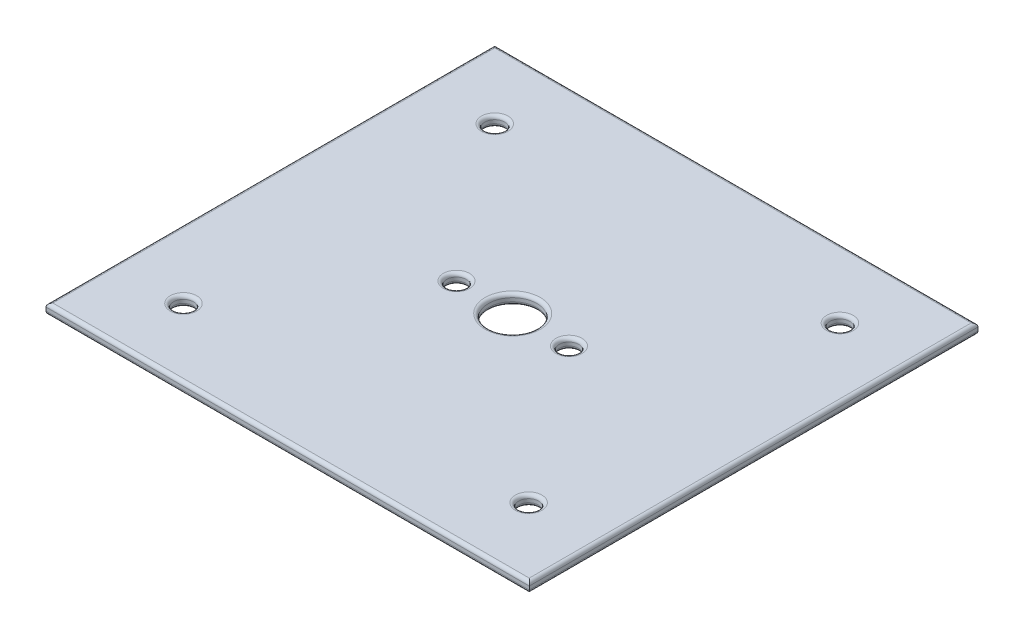
ISO-10303-21;
HEADER;
FILE_DESCRIPTION(('STEP AP214'),'2;1');
FILE_NAME('part.step','',(''),(''),'','','');
FILE_SCHEMA(('AUTOMOTIVE_DESIGN { 1 0 10303 214 1 1 1 1 }'));
ENDSEC;
DATA;
#1=APPLICATION_CONTEXT('core data for automotive mechanical design processes');
#2=APPLICATION_PROTOCOL_DEFINITION('international standard','automotive_design',2000,#1);
#3=PRODUCT_CONTEXT('',#1,'mechanical');
#4=PRODUCT('Part','Part','',(#3));
#5=PRODUCT_RELATED_PRODUCT_CATEGORY('part','',(#4));
#6=PRODUCT_DEFINITION_FORMATION('','',#4);
#7=PRODUCT_DEFINITION_CONTEXT('part definition',#1,'design');
#8=PRODUCT_DEFINITION('design','',#6,#7);
#9=PRODUCT_DEFINITION_SHAPE('','',#8);
#10=(LENGTH_UNIT() NAMED_UNIT(*) SI_UNIT(.MILLI.,.METRE.));
#11=(NAMED_UNIT(*) PLANE_ANGLE_UNIT() SI_UNIT($,.RADIAN.));
#12=(NAMED_UNIT(*) SI_UNIT($,.STERADIAN.) SOLID_ANGLE_UNIT());
#13=UNCERTAINTY_MEASURE_WITH_UNIT(LENGTH_MEASURE(1.E-05),#10,'distance_accuracy_value','');
#14=(GEOMETRIC_REPRESENTATION_CONTEXT(3) GLOBAL_UNCERTAINTY_ASSIGNED_CONTEXT((#13)) GLOBAL_UNIT_ASSIGNED_CONTEXT((#10,
#11,#12)) REPRESENTATION_CONTEXT('',''));
#15=CARTESIAN_POINT('',(0.,0.,0.));
#16=DIRECTION('',(0.,0.,1.));
#17=DIRECTION('',(1.,0.,0.));
#18=AXIS2_PLACEMENT_3D('',#15,#16,#17);
#19=CARTESIAN_POINT('',(0.,1.5,0.));
#20=DIRECTION('',(1.,0.,0.));
#21=DIRECTION('',(0.,0.,-1.));
#22=AXIS2_PLACEMENT_3D('',#19,#20,#21);
#23=PLANE('',#22);
#24=DIRECTION('',(0.,-1.,0.));
#25=VECTOR('',#24,1.);
#26=CARTESIAN_POINT('',(0.,1.5,-65.));
#27=LINE('',#26,#25);
#28=CARTESIAN_POINT('',(0.,1.,-65.));
#29=VERTEX_POINT('',#28);
#30=CARTESIAN_POINT('',(0.,0.5,-65.));
#31=VERTEX_POINT('',#30);
#32=EDGE_CURVE('E162',#29,#31,#27,.T.);
#33=ORIENTED_EDGE('',*,*,#32,.T.);
#34=DIRECTION('',(0.,0.,1.));
#35=VECTOR('',#34,1.);
#36=CARTESIAN_POINT('',(0.,0.5,0.));
#37=LINE('',#36,#35);
#38=CARTESIAN_POINT('',(0.,0.5,0.));
#39=VERTEX_POINT('',#38);
#40=EDGE_CURVE('E260',#31,#39,#37,.T.);
#41=ORIENTED_EDGE('',*,*,#40,.T.);
#42=DIRECTION('',(0.,-1.,0.));
#43=VECTOR('',#42,1.);
#44=CARTESIAN_POINT('',(0.,1.5,0.));
#45=LINE('',#44,#43);
#46=CARTESIAN_POINT('',(0.,1.,0.));
#47=VERTEX_POINT('',#46);
#48=EDGE_CURVE('E132',#47,#39,#45,.T.);
#49=ORIENTED_EDGE('',*,*,#48,.F.);
#50=DIRECTION('',(0.,0.,1.));
#51=VECTOR('',#50,1.);
#52=CARTESIAN_POINT('',(0.,1.,0.));
#53=LINE('',#52,#51);
#54=EDGE_CURVE('E263',#47,#29,#53,.F.);
#55=ORIENTED_EDGE('',*,*,#54,.T.);
#56=EDGE_LOOP('',(#33,#41,#49,#55));
#57=FACE_BOUND('',#56,.T.);
#58=ADVANCED_FACE('F42',(#57),#23,.F.);
#59=CARTESIAN_POINT('',(0.,1.5,0.));
#60=DIRECTION('',(0.,0.,-1.));
#61=DIRECTION('',(-1.,0.,0.));
#62=AXIS2_PLACEMENT_3D('',#59,#60,#61);
#63=PLANE('',#62);
#64=ORIENTED_EDGE('',*,*,#48,.T.);
#65=DIRECTION('',(1.,0.,0.));
#66=VECTOR('',#65,1.);
#67=CARTESIAN_POINT('',(70.,0.5,0.));
#68=LINE('',#67,#66);
#69=CARTESIAN_POINT('',(70.,0.5,0.));
#70=VERTEX_POINT('',#69);
#71=EDGE_CURVE('E130',#39,#70,#68,.T.);
#72=ORIENTED_EDGE('',*,*,#71,.T.);
#73=DIRECTION('',(0.,-1.,0.));
#74=VECTOR('',#73,1.);
#75=CARTESIAN_POINT('',(70.,1.5,0.));
#76=LINE('',#75,#74);
#77=CARTESIAN_POINT('',(70.,1.,0.));
#78=VERTEX_POINT('',#77);
#79=EDGE_CURVE('E112',#78,#70,#76,.T.);
#80=ORIENTED_EDGE('',*,*,#79,.F.);
#81=DIRECTION('',(1.,0.,0.));
#82=VECTOR('',#81,1.);
#83=CARTESIAN_POINT('',(0.,1.,0.));
#84=LINE('',#83,#82);
#85=EDGE_CURVE('E127',#78,#47,#84,.F.);
#86=ORIENTED_EDGE('',*,*,#85,.T.);
#87=EDGE_LOOP('',(#64,#72,#80,#86));
#88=FACE_BOUND('',#87,.T.);
#89=ADVANCED_FACE('F126',(#88),#63,.F.);
#90=CARTESIAN_POINT('',(70.,1.5,0.));
#91=DIRECTION('',(-1.,0.,0.));
#92=DIRECTION('',(0.,0.,1.));
#93=AXIS2_PLACEMENT_3D('',#90,#91,#92);
#94=PLANE('',#93);
#95=ORIENTED_EDGE('',*,*,#79,.T.);
#96=DIRECTION('',(0.,0.,-1.));
#97=VECTOR('',#96,1.);
#98=CARTESIAN_POINT('',(70.,0.5,-65.));
#99=LINE('',#98,#97);
#100=CARTESIAN_POINT('',(70.,0.5,-65.));
#101=VERTEX_POINT('',#100);
#102=EDGE_CURVE('E119',#70,#101,#99,.T.);
#103=ORIENTED_EDGE('',*,*,#102,.T.);
#104=DIRECTION('',(0.,-1.,0.));
#105=VECTOR('',#104,1.);
#106=CARTESIAN_POINT('',(70.,1.5,-65.));
#107=LINE('',#106,#105);
#108=CARTESIAN_POINT('',(70.,1.,-65.));
#109=VERTEX_POINT('',#108);
#110=EDGE_CURVE('E114',#109,#101,#107,.T.);
#111=ORIENTED_EDGE('',*,*,#110,.F.);
#112=DIRECTION('',(0.,0.,-1.));
#113=VECTOR('',#112,1.);
#114=CARTESIAN_POINT('',(70.,1.,0.));
#115=LINE('',#114,#113);
#116=EDGE_CURVE('E109',#109,#78,#115,.F.);
#117=ORIENTED_EDGE('',*,*,#116,.T.);
#118=EDGE_LOOP('',(#95,#103,#111,#117));
#119=FACE_BOUND('',#118,.T.);
#120=ADVANCED_FACE('F111',(#119),#94,.F.);
#121=CARTESIAN_POINT('',(0.,1.5,-65.));
#122=DIRECTION('',(0.,0.,1.));
#123=DIRECTION('',(1.,0.,0.));
#124=AXIS2_PLACEMENT_3D('',#121,#122,#123);
#125=PLANE('',#124);
#126=ORIENTED_EDGE('',*,*,#110,.T.);
#127=DIRECTION('',(-1.,0.,0.));
#128=VECTOR('',#127,1.);
#129=CARTESIAN_POINT('',(0.,0.5,-65.));
#130=LINE('',#129,#128);
#131=EDGE_CURVE('E266',#101,#31,#130,.T.);
#132=ORIENTED_EDGE('',*,*,#131,.T.);
#133=ORIENTED_EDGE('',*,*,#32,.F.);
#134=DIRECTION('',(-1.,0.,0.));
#135=VECTOR('',#134,1.);
#136=CARTESIAN_POINT('',(0.,1.,-65.));
#137=LINE('',#136,#135);
#138=EDGE_CURVE('E269',#29,#109,#137,.F.);
#139=ORIENTED_EDGE('',*,*,#138,.T.);
#140=EDGE_LOOP('',(#126,#132,#133,#139));
#141=FACE_BOUND('',#140,.T.);
#142=ADVANCED_FACE('F345',(#141),#125,.F.);
#143=CARTESIAN_POINT('',(0.,1.5,0.));
#144=DIRECTION('',(0.,-1.,0.));
#145=DIRECTION('',(0.,0.,-1.));
#146=AXIS2_PLACEMENT_3D('',#143,#144,#145);
#147=PLANE('',#146);
#148=DIRECTION('',(0.,0.,-1.));
#149=VECTOR('',#148,1.);
#150=CARTESIAN_POINT('',(69.5,1.5,0.));
#151=LINE('',#150,#149);
#152=CARTESIAN_POINT('',(69.5,1.5,-0.5));
#153=VERTEX_POINT('',#152);
#154=CARTESIAN_POINT('',(69.5,1.5,-64.5));
#155=VERTEX_POINT('',#154);
#156=EDGE_CURVE('E52',#153,#155,#151,.T.);
#157=ORIENTED_EDGE('',*,*,#156,.T.);
#158=DIRECTION('',(-1.,0.,0.));
#159=VECTOR('',#158,1.);
#160=CARTESIAN_POINT('',(0.,1.5,-64.5));
#161=LINE('',#160,#159);
#162=CARTESIAN_POINT('',(0.5,1.5,-64.5));
#163=VERTEX_POINT('',#162);
#164=EDGE_CURVE('E11',#155,#163,#161,.T.);
#165=ORIENTED_EDGE('',*,*,#164,.T.);
#166=DIRECTION('',(0.,0.,1.));
#167=VECTOR('',#166,1.);
#168=CARTESIAN_POINT('',(0.5,1.5,0.));
#169=LINE('',#168,#167);
#170=CARTESIAN_POINT('',(0.5,1.5,-0.5));
#171=VERTEX_POINT('',#170);
#172=EDGE_CURVE('E173',#163,#171,#169,.T.);
#173=ORIENTED_EDGE('',*,*,#172,.T.);
#174=DIRECTION('',(1.,0.,0.));
#175=VECTOR('',#174,1.);
#176=CARTESIAN_POINT('',(0.,1.5,-0.5));
#177=LINE('',#176,#175);
#178=EDGE_CURVE('E63',#171,#153,#177,.T.);
#179=ORIENTED_EDGE('',*,*,#178,.T.);
#180=EDGE_LOOP('',(#157,#165,#173,#179));
#181=FACE_BOUND('',#180,.T.);
#182=CARTESIAN_POINT('',(60.0000000000011,1.5,-55.0000000000034));
#183=DIRECTION('',(0.,-1.,0.));
#184=DIRECTION('',(0.,0.,-1.));
#185=AXIS2_PLACEMENT_3D('',#182,#183,#184);
#186=CIRCLE('',#185,1.9224);
#187=CARTESIAN_POINT('',(60.0000000000011,1.5,-56.9224000000034));
#188=VERTEX_POINT('',#187);
#189=EDGE_CURVE('E176',#188,#188,#186,.T.);
#190=ORIENTED_EDGE('',*,*,#189,.T.);
#191=EDGE_LOOP('',(#190));
#192=FACE_BOUND('',#191,.T.);
#193=CARTESIAN_POINT('',(26.9537377842465,1.5,-32.5));
#194=DIRECTION('',(0.,-1.,0.));
#195=DIRECTION('',(0.,0.,-1.));
#196=AXIS2_PLACEMENT_3D('',#193,#194,#195);
#197=CIRCLE('',#196,1.9);
#198=CARTESIAN_POINT('',(26.9537377842465,1.5,-34.4));
#199=VERTEX_POINT('',#198);
#200=EDGE_CURVE('E180',#199,#199,#197,.T.);
#201=ORIENTED_EDGE('',*,*,#200,.T.);
#202=EDGE_LOOP('',(#201));
#203=FACE_BOUND('',#202,.T.);
#204=CARTESIAN_POINT('',(43.2517387376343,1.5,-32.5));
#205=DIRECTION('',(0.,-1.,0.));
#206=DIRECTION('',(0.,0.,-1.));
#207=AXIS2_PLACEMENT_3D('',#204,#205,#206);
#208=CIRCLE('',#207,1.9);
#209=CARTESIAN_POINT('',(43.2517387376343,1.5,-34.4));
#210=VERTEX_POINT('',#209);
#211=EDGE_CURVE('E184',#210,#210,#208,.T.);
#212=ORIENTED_EDGE('',*,*,#211,.T.);
#213=EDGE_LOOP('',(#212));
#214=FACE_BOUND('',#213,.T.);
#215=CARTESIAN_POINT('',(35.1027382609404,1.5,-32.5018507906117));
#216=DIRECTION('',(0.,-1.,0.));
#217=DIRECTION('',(0.,0.,-1.));
#218=AXIS2_PLACEMENT_3D('',#215,#216,#217);
#219=CIRCLE('',#218,4.);
#220=CARTESIAN_POINT('',(35.1027382609404,1.5,-36.5018507906117));
#221=VERTEX_POINT('',#220);
#222=EDGE_CURVE('E188',#221,#221,#219,.T.);
#223=ORIENTED_EDGE('',*,*,#222,.T.);
#224=EDGE_LOOP('',(#223));
#225=FACE_BOUND('',#224,.T.);
#226=CARTESIAN_POINT('',(9.99999999999545,1.5,-55.0000000000034));
#227=DIRECTION('',(0.,-1.,0.));
#228=DIRECTION('',(0.,0.,-1.));
#229=AXIS2_PLACEMENT_3D('',#226,#227,#228);
#230=CIRCLE('',#229,1.9224);
#231=CARTESIAN_POINT('',(9.99999999999545,1.5,-56.9224000000034));
#232=VERTEX_POINT('',#231);
#233=EDGE_CURVE('E192',#232,#232,#230,.T.);
#234=ORIENTED_EDGE('',*,*,#233,.T.);
#235=EDGE_LOOP('',(#234));
#236=FACE_BOUND('',#235,.T.);
#237=CARTESIAN_POINT('',(10.,1.5,-9.91212128823804));
#238=DIRECTION('',(0.,-1.,0.));
#239=DIRECTION('',(0.,0.,-1.));
#240=AXIS2_PLACEMENT_3D('',#237,#238,#239);
#241=CIRCLE('',#240,1.9224);
#242=CARTESIAN_POINT('',(10.,1.5,-11.834521288238));
#243=VERTEX_POINT('',#242);
#244=EDGE_CURVE('E196',#243,#243,#241,.T.);
#245=ORIENTED_EDGE('',*,*,#244,.T.);
#246=EDGE_LOOP('',(#245));
#247=FACE_BOUND('',#246,.T.);
#248=CARTESIAN_POINT('',(60.,1.5,-9.91212128823804));
#249=DIRECTION('',(0.,-1.,0.));
#250=DIRECTION('',(0.,0.,-1.));
#251=AXIS2_PLACEMENT_3D('',#248,#249,#250);
#252=CIRCLE('',#251,1.92239999999999);
#253=CARTESIAN_POINT('',(60.,1.5,-11.834521288238));
#254=VERTEX_POINT('',#253);
#255=EDGE_CURVE('E200',#254,#254,#252,.T.);
#256=ORIENTED_EDGE('',*,*,#255,.T.);
#257=EDGE_LOOP('',(#256));
#258=FACE_BOUND('',#257,.T.);
#259=ADVANCED_FACE('F351',(#181,#192,#203,#214,#225,#236,#247,#258),#147,.F.);
#260=CARTESIAN_POINT('',(0.,0.,0.));
#261=DIRECTION('',(0.,-1.,0.));
#262=DIRECTION('',(0.,0.,-1.));
#263=AXIS2_PLACEMENT_3D('',#260,#261,#262);
#264=PLANE('',#263);
#265=DIRECTION('',(0.,0.,-1.));
#266=VECTOR('',#265,1.);
#267=CARTESIAN_POINT('',(69.5,0.,0.));
#268=LINE('',#267,#266);
#269=CARTESIAN_POINT('',(69.5,0.,-64.5));
#270=VERTEX_POINT('',#269);
#271=CARTESIAN_POINT('',(69.5,0.,-0.5));
#272=VERTEX_POINT('',#271);
#273=EDGE_CURVE('E277',#270,#272,#268,.F.);
#274=ORIENTED_EDGE('',*,*,#273,.T.);
#275=DIRECTION('',(1.,0.,0.));
#276=VECTOR('',#275,1.);
#277=CARTESIAN_POINT('',(0.,0.,-0.5));
#278=LINE('',#277,#276);
#279=CARTESIAN_POINT('',(0.5,0.,-0.5));
#280=VERTEX_POINT('',#279);
#281=EDGE_CURVE('E120',#272,#280,#278,.F.);
#282=ORIENTED_EDGE('',*,*,#281,.T.);
#283=DIRECTION('',(0.,0.,1.));
#284=VECTOR('',#283,1.);
#285=CARTESIAN_POINT('',(0.5,0.,-65.));
#286=LINE('',#285,#284);
#287=CARTESIAN_POINT('',(0.5,0.,-64.5));
#288=VERTEX_POINT('',#287);
#289=EDGE_CURVE('E283',#280,#288,#286,.F.);
#290=ORIENTED_EDGE('',*,*,#289,.T.);
#291=DIRECTION('',(-1.,0.,0.));
#292=VECTOR('',#291,1.);
#293=CARTESIAN_POINT('',(70.,0.,-64.5));
#294=LINE('',#293,#292);
#295=EDGE_CURVE('E280',#288,#270,#294,.F.);
#296=ORIENTED_EDGE('',*,*,#295,.T.);
#297=EDGE_LOOP('',(#274,#282,#290,#296));
#298=FACE_BOUND('',#297,.T.);
#299=CARTESIAN_POINT('',(60.0000000000011,0.,-55.0000000000034));
#300=DIRECTION('',(0.,-1.,0.));
#301=DIRECTION('',(0.,0.,-1.));
#302=AXIS2_PLACEMENT_3D('',#299,#300,#301);
#303=CIRCLE('',#302,1.9224);
#304=CARTESIAN_POINT('',(60.0000000000011,0.,-56.9224000000034));
#305=VERTEX_POINT('',#304);
#306=EDGE_CURVE('E286',#305,#305,#303,.F.);
#307=ORIENTED_EDGE('',*,*,#306,.T.);
#308=EDGE_LOOP('',(#307));
#309=FACE_BOUND('',#308,.T.);
#310=CARTESIAN_POINT('',(26.9537377842465,0.,-32.5));
#311=DIRECTION('',(0.,-1.,0.));
#312=DIRECTION('',(0.,0.,-1.));
#313=AXIS2_PLACEMENT_3D('',#310,#311,#312);
#314=CIRCLE('',#313,1.9);
#315=CARTESIAN_POINT('',(26.9537377842465,0.,-34.4));
#316=VERTEX_POINT('',#315);
#317=EDGE_CURVE('E290',#316,#316,#314,.F.);
#318=ORIENTED_EDGE('',*,*,#317,.T.);
#319=EDGE_LOOP('',(#318));
#320=FACE_BOUND('',#319,.T.);
#321=CARTESIAN_POINT('',(43.2517387376343,0.,-32.5));
#322=DIRECTION('',(0.,-1.,0.));
#323=DIRECTION('',(0.,0.,-1.));
#324=AXIS2_PLACEMENT_3D('',#321,#322,#323);
#325=CIRCLE('',#324,1.9);
#326=CARTESIAN_POINT('',(43.2517387376343,0.,-34.4));
#327=VERTEX_POINT('',#326);
#328=EDGE_CURVE('E294',#327,#327,#325,.F.);
#329=ORIENTED_EDGE('',*,*,#328,.T.);
#330=EDGE_LOOP('',(#329));
#331=FACE_BOUND('',#330,.T.);
#332=CARTESIAN_POINT('',(35.1027382609404,0.,-32.5018507906117));
#333=DIRECTION('',(0.,-1.,0.));
#334=DIRECTION('',(0.,0.,-1.));
#335=AXIS2_PLACEMENT_3D('',#332,#333,#334);
#336=CIRCLE('',#335,4.);
#337=CARTESIAN_POINT('',(35.1027382609404,0.,-36.5018507906117));
#338=VERTEX_POINT('',#337);
#339=EDGE_CURVE('E298',#338,#338,#336,.F.);
#340=ORIENTED_EDGE('',*,*,#339,.T.);
#341=EDGE_LOOP('',(#340));
#342=FACE_BOUND('',#341,.T.);
#343=CARTESIAN_POINT('',(9.99999999999545,0.,-55.0000000000034));
#344=DIRECTION('',(0.,-1.,0.));
#345=DIRECTION('',(0.,0.,-1.));
#346=AXIS2_PLACEMENT_3D('',#343,#344,#345);
#347=CIRCLE('',#346,1.9224);
#348=CARTESIAN_POINT('',(9.99999999999545,0.,-56.9224000000034));
#349=VERTEX_POINT('',#348);
#350=EDGE_CURVE('E302',#349,#349,#347,.F.);
#351=ORIENTED_EDGE('',*,*,#350,.T.);
#352=EDGE_LOOP('',(#351));
#353=FACE_BOUND('',#352,.T.);
#354=CARTESIAN_POINT('',(10.,0.,-9.91212128823804));
#355=DIRECTION('',(0.,-1.,0.));
#356=DIRECTION('',(0.,0.,-1.));
#357=AXIS2_PLACEMENT_3D('',#354,#355,#356);
#358=CIRCLE('',#357,1.9224);
#359=CARTESIAN_POINT('',(10.,0.,-11.834521288238));
#360=VERTEX_POINT('',#359);
#361=EDGE_CURVE('E306',#360,#360,#358,.F.);
#362=ORIENTED_EDGE('',*,*,#361,.T.);
#363=EDGE_LOOP('',(#362));
#364=FACE_BOUND('',#363,.T.);
#365=CARTESIAN_POINT('',(60.,0.,-9.91212128823804));
#366=DIRECTION('',(0.,-1.,0.));
#367=DIRECTION('',(0.,0.,-1.));
#368=AXIS2_PLACEMENT_3D('',#365,#366,#367);
#369=CIRCLE('',#368,1.92239999999999);
#370=CARTESIAN_POINT('',(60.,0.,-11.834521288238));
#371=VERTEX_POINT('',#370);
#372=EDGE_CURVE('E310',#371,#371,#369,.F.);
#373=ORIENTED_EDGE('',*,*,#372,.T.);
#374=EDGE_LOOP('',(#373));
#375=FACE_BOUND('',#374,.T.);
#376=ADVANCED_FACE('F354',(#298,#309,#320,#331,#342,#353,#364,#375),#264,.T.);
#377=CARTESIAN_POINT('',(60.0000000000011,-8.5,-55.0000000000034));
#378=DIRECTION('',(0.,1.,0.));
#379=DIRECTION('',(0.,0.,1.));
#380=AXIS2_PLACEMENT_3D('',#377,#378,#379);
#381=CYLINDRICAL_SURFACE('',#380,1.4224);
#382=CARTESIAN_POINT('',(60.0000000000011,0.5,-55.0000000000034));
#383=DIRECTION('',(0.,-1.,0.));
#384=DIRECTION('',(0.,0.,-1.));
#385=AXIS2_PLACEMENT_3D('',#382,#383,#384);
#386=CIRCLE('',#385,1.4224);
#387=CARTESIAN_POINT('',(60.0000000000011,0.5,-56.4224000000034));
#388=VERTEX_POINT('',#387);
#389=EDGE_CURVE('E252',#388,#388,#386,.T.);
#390=ORIENTED_EDGE('',*,*,#389,.T.);
#391=EDGE_LOOP('',(#390));
#392=FACE_BOUND('',#391,.T.);
#393=CARTESIAN_POINT('',(60.0000000000011,1.,-55.0000000000034));
#394=DIRECTION('',(0.,-1.,0.));
#395=DIRECTION('',(0.,0.,-1.));
#396=AXIS2_PLACEMENT_3D('',#393,#394,#395);
#397=CIRCLE('',#396,1.4224);
#398=CARTESIAN_POINT('',(60.0000000000011,1.,-56.4224000000034));
#399=VERTEX_POINT('',#398);
#400=EDGE_CURVE('E256',#399,#399,#397,.F.);
#401=ORIENTED_EDGE('',*,*,#400,.T.);
#402=EDGE_LOOP('',(#401));
#403=FACE_BOUND('',#402,.T.);
#404=ADVANCED_FACE('F673',(#392,#403),#381,.F.);
#405=CARTESIAN_POINT('',(26.9537377842465,-8.5,-32.5));
#406=DIRECTION('',(0.,1.,0.));
#407=DIRECTION('',(0.,0.,1.));
#408=AXIS2_PLACEMENT_3D('',#405,#406,#407);
#409=CYLINDRICAL_SURFACE('',#408,1.4);
#410=CARTESIAN_POINT('',(26.9537377842465,0.5,-32.5));
#411=DIRECTION('',(0.,-1.,0.));
#412=DIRECTION('',(0.,0.,-1.));
#413=AXIS2_PLACEMENT_3D('',#410,#411,#412);
#414=CIRCLE('',#413,1.4);
#415=CARTESIAN_POINT('',(26.9537377842465,0.5,-33.9));
#416=VERTEX_POINT('',#415);
#417=EDGE_CURVE('E244',#416,#416,#414,.T.);
#418=ORIENTED_EDGE('',*,*,#417,.T.);
#419=EDGE_LOOP('',(#418));
#420=FACE_BOUND('',#419,.T.);
#421=CARTESIAN_POINT('',(26.9537377842465,1.,-32.5));
#422=DIRECTION('',(0.,-1.,0.));
#423=DIRECTION('',(0.,0.,-1.));
#424=AXIS2_PLACEMENT_3D('',#421,#422,#423);
#425=CIRCLE('',#424,1.4);
#426=CARTESIAN_POINT('',(26.9537377842465,1.,-33.9));
#427=VERTEX_POINT('',#426);
#428=EDGE_CURVE('E248',#427,#427,#425,.F.);
#429=ORIENTED_EDGE('',*,*,#428,.T.);
#430=EDGE_LOOP('',(#429));
#431=FACE_BOUND('',#430,.T.);
#432=ADVANCED_FACE('F662',(#420,#431),#409,.F.);
#433=CARTESIAN_POINT('',(43.2517387376343,-8.5,-32.5));
#434=DIRECTION('',(0.,1.,0.));
#435=DIRECTION('',(0.,0.,1.));
#436=AXIS2_PLACEMENT_3D('',#433,#434,#435);
#437=CYLINDRICAL_SURFACE('',#436,1.4);
#438=CARTESIAN_POINT('',(43.2517387376343,0.5,-32.5));
#439=DIRECTION('',(0.,-1.,0.));
#440=DIRECTION('',(0.,0.,-1.));
#441=AXIS2_PLACEMENT_3D('',#438,#439,#440);
#442=CIRCLE('',#441,1.4);
#443=CARTESIAN_POINT('',(43.2517387376343,0.5,-33.9));
#444=VERTEX_POINT('',#443);
#445=EDGE_CURVE('E236',#444,#444,#442,.T.);
#446=ORIENTED_EDGE('',*,*,#445,.T.);
#447=EDGE_LOOP('',(#446));
#448=FACE_BOUND('',#447,.T.);
#449=CARTESIAN_POINT('',(43.2517387376343,1.,-32.5));
#450=DIRECTION('',(0.,-1.,0.));
#451=DIRECTION('',(0.,0.,-1.));
#452=AXIS2_PLACEMENT_3D('',#449,#450,#451);
#453=CIRCLE('',#452,1.4);
#454=CARTESIAN_POINT('',(43.2517387376343,1.,-33.9));
#455=VERTEX_POINT('',#454);
#456=EDGE_CURVE('E240',#455,#455,#453,.F.);
#457=ORIENTED_EDGE('',*,*,#456,.T.);
#458=EDGE_LOOP('',(#457));
#459=FACE_BOUND('',#458,.T.);
#460=ADVANCED_FACE('F651',(#448,#459),#437,.F.);
#461=CARTESIAN_POINT('',(35.1027382609404,-8.5,-32.5018507906117));
#462=DIRECTION('',(0.,1.,0.));
#463=DIRECTION('',(0.,0.,1.));
#464=AXIS2_PLACEMENT_3D('',#461,#462,#463);
#465=CYLINDRICAL_SURFACE('',#464,3.5);
#466=CARTESIAN_POINT('',(35.1027382609404,0.5,-32.5018507906117));
#467=DIRECTION('',(0.,-1.,0.));
#468=DIRECTION('',(0.,0.,-1.));
#469=AXIS2_PLACEMENT_3D('',#466,#467,#468);
#470=CIRCLE('',#469,3.5);
#471=CARTESIAN_POINT('',(35.1027382609404,0.5,-36.0018507906117));
#472=VERTEX_POINT('',#471);
#473=EDGE_CURVE('E228',#472,#472,#470,.T.);
#474=ORIENTED_EDGE('',*,*,#473,.T.);
#475=EDGE_LOOP('',(#474));
#476=FACE_BOUND('',#475,.T.);
#477=CARTESIAN_POINT('',(35.1027382609404,1.,-32.5018507906117));
#478=DIRECTION('',(0.,-1.,0.));
#479=DIRECTION('',(0.,0.,-1.));
#480=AXIS2_PLACEMENT_3D('',#477,#478,#479);
#481=CIRCLE('',#480,3.5);
#482=CARTESIAN_POINT('',(35.1027382609404,1.,-36.0018507906117));
#483=VERTEX_POINT('',#482);
#484=EDGE_CURVE('E232',#483,#483,#481,.F.);
#485=ORIENTED_EDGE('',*,*,#484,.T.);
#486=EDGE_LOOP('',(#485));
#487=FACE_BOUND('',#486,.T.);
#488=ADVANCED_FACE('F640',(#476,#487),#465,.F.);
#489=CARTESIAN_POINT('',(9.99999999999545,-8.5,-55.0000000000034));
#490=DIRECTION('',(0.,1.,0.));
#491=DIRECTION('',(0.,0.,1.));
#492=AXIS2_PLACEMENT_3D('',#489,#490,#491);
#493=CYLINDRICAL_SURFACE('',#492,1.4224);
#494=CARTESIAN_POINT('',(9.99999999999545,0.5,-55.0000000000034));
#495=DIRECTION('',(0.,-1.,0.));
#496=DIRECTION('',(0.,0.,-1.));
#497=AXIS2_PLACEMENT_3D('',#494,#495,#496);
#498=CIRCLE('',#497,1.4224);
#499=CARTESIAN_POINT('',(9.99999999999545,0.5,-56.4224000000034));
#500=VERTEX_POINT('',#499);
#501=EDGE_CURVE('E220',#500,#500,#498,.T.);
#502=ORIENTED_EDGE('',*,*,#501,.T.);
#503=EDGE_LOOP('',(#502));
#504=FACE_BOUND('',#503,.T.);
#505=CARTESIAN_POINT('',(9.99999999999545,1.,-55.0000000000034));
#506=DIRECTION('',(0.,-1.,0.));
#507=DIRECTION('',(0.,0.,-1.));
#508=AXIS2_PLACEMENT_3D('',#505,#506,#507);
#509=CIRCLE('',#508,1.4224);
#510=CARTESIAN_POINT('',(9.99999999999545,1.,-56.4224000000034));
#511=VERTEX_POINT('',#510);
#512=EDGE_CURVE('E224',#511,#511,#509,.F.);
#513=ORIENTED_EDGE('',*,*,#512,.T.);
#514=EDGE_LOOP('',(#513));
#515=FACE_BOUND('',#514,.T.);
#516=ADVANCED_FACE('F386',(#504,#515),#493,.F.);
#517=CARTESIAN_POINT('',(10.,-8.5,-9.91212128823804));
#518=DIRECTION('',(0.,1.,0.));
#519=DIRECTION('',(0.,0.,1.));
#520=AXIS2_PLACEMENT_3D('',#517,#518,#519);
#521=CYLINDRICAL_SURFACE('',#520,1.4224);
#522=CARTESIAN_POINT('',(10.,0.5,-9.91212128823804));
#523=DIRECTION('',(0.,-1.,0.));
#524=DIRECTION('',(0.,0.,-1.));
#525=AXIS2_PLACEMENT_3D('',#522,#523,#524);
#526=CIRCLE('',#525,1.4224);
#527=CARTESIAN_POINT('',(10.,0.5,-11.334521288238));
#528=VERTEX_POINT('',#527);
#529=EDGE_CURVE('E212',#528,#528,#526,.T.);
#530=ORIENTED_EDGE('',*,*,#529,.T.);
#531=EDGE_LOOP('',(#530));
#532=FACE_BOUND('',#531,.T.);
#533=CARTESIAN_POINT('',(10.,1.,-9.91212128823804));
#534=DIRECTION('',(0.,-1.,0.));
#535=DIRECTION('',(0.,0.,-1.));
#536=AXIS2_PLACEMENT_3D('',#533,#534,#535);
#537=CIRCLE('',#536,1.4224);
#538=CARTESIAN_POINT('',(10.,1.,-11.334521288238));
#539=VERTEX_POINT('',#538);
#540=EDGE_CURVE('E216',#539,#539,#537,.F.);
#541=ORIENTED_EDGE('',*,*,#540,.T.);
#542=EDGE_LOOP('',(#541));
#543=FACE_BOUND('',#542,.T.);
#544=ADVANCED_FACE('F377',(#532,#543),#521,.F.);
#545=CARTESIAN_POINT('',(60.,-8.5,-9.91212128823804));
#546=DIRECTION('',(0.,1.,0.));
#547=DIRECTION('',(0.,0.,1.));
#548=AXIS2_PLACEMENT_3D('',#545,#546,#547);
#549=CYLINDRICAL_SURFACE('',#548,1.42239999999999);
#550=CARTESIAN_POINT('',(60.,0.5,-9.91212128823804));
#551=DIRECTION('',(0.,-1.,0.));
#552=DIRECTION('',(0.,0.,-1.));
#553=AXIS2_PLACEMENT_3D('',#550,#551,#552);
#554=CIRCLE('',#553,1.42239999999999);
#555=CARTESIAN_POINT('',(60.,0.5,-11.334521288238));
#556=VERTEX_POINT('',#555);
#557=EDGE_CURVE('E204',#556,#556,#554,.T.);
#558=ORIENTED_EDGE('',*,*,#557,.T.);
#559=EDGE_LOOP('',(#558));
#560=FACE_BOUND('',#559,.T.);
#561=CARTESIAN_POINT('',(60.,1.,-9.91212128823804));
#562=DIRECTION('',(0.,-1.,0.));
#563=DIRECTION('',(0.,0.,-1.));
#564=AXIS2_PLACEMENT_3D('',#561,#562,#563);
#565=CIRCLE('',#564,1.42239999999999);
#566=CARTESIAN_POINT('',(60.,1.,-11.334521288238));
#567=VERTEX_POINT('',#566);
#568=EDGE_CURVE('E208',#567,#567,#565,.F.);
#569=ORIENTED_EDGE('',*,*,#568,.T.);
#570=EDGE_LOOP('',(#569));
#571=FACE_BOUND('',#570,.T.);
#572=ADVANCED_FACE('F375',(#560,#571),#549,.F.);
#573=CARTESIAN_POINT('',(0.,0.5,-64.5));
#574=DIRECTION('',(1.,0.,0.));
#575=DIRECTION('',(0.,0.,-1.));
#576=AXIS2_PLACEMENT_3D('',#573,#574,#575);
#577=CYLINDRICAL_SURFACE('',#576,0.5);
#578=CARTESIAN_POINT('',(69.5,0.5,-64.5));
#579=DIRECTION('',(0.707106781186547,0.,0.707106781186547));
#580=DIRECTION('',(0.707106781186547,0.,-0.707106781186547));
#581=AXIS2_PLACEMENT_3D('',#578,#579,#580);
#582=ELLIPSE('',#581,0.707106781186547,0.5);
#583=EDGE_CURVE('E163',#270,#101,#582,.T.);
#584=ORIENTED_EDGE('',*,*,#583,.F.);
#585=ORIENTED_EDGE('',*,*,#295,.F.);
#586=CARTESIAN_POINT('',(0.5,0.5,-64.5));
#587=DIRECTION('',(0.707106781186547,0.,-0.707106781186547));
#588=DIRECTION('',(-0.707106781186547,0.,-0.707106781186547));
#589=AXIS2_PLACEMENT_3D('',#586,#587,#588);
#590=ELLIPSE('',#589,0.707106781186547,0.5);
#591=EDGE_CURVE('E158',#31,#288,#590,.F.);
#592=ORIENTED_EDGE('',*,*,#591,.F.);
#593=ORIENTED_EDGE('',*,*,#131,.F.);
#594=EDGE_LOOP('',(#584,#585,#592,#593));
#595=FACE_BOUND('',#594,.T.);
#596=ADVANCED_FACE('F332',(#595),#577,.T.);
#597=CARTESIAN_POINT('',(0.5,0.5,0.));
#598=DIRECTION('',(0.,0.,-1.));
#599=DIRECTION('',(-1.,0.,0.));
#600=AXIS2_PLACEMENT_3D('',#597,#598,#599);
#601=CYLINDRICAL_SURFACE('',#600,0.5);
#602=ORIENTED_EDGE('',*,*,#591,.T.);
#603=ORIENTED_EDGE('',*,*,#289,.F.);
#604=CARTESIAN_POINT('',(0.5,0.5,-0.5));
#605=DIRECTION('',(-0.707106781186547,0.,-0.707106781186547));
#606=DIRECTION('',(0.707106781186547,0.,-0.707106781186547));
#607=AXIS2_PLACEMENT_3D('',#604,#605,#606);
#608=ELLIPSE('',#607,0.707106781186547,0.5);
#609=EDGE_CURVE('E147',#39,#280,#608,.F.);
#610=ORIENTED_EDGE('',*,*,#609,.F.);
#611=ORIENTED_EDGE('',*,*,#40,.F.);
#612=EDGE_LOOP('',(#602,#603,#610,#611));
#613=FACE_BOUND('',#612,.T.);
#614=ADVANCED_FACE('F336',(#613),#601,.T.);
#615=CARTESIAN_POINT('',(69.5,0.5,0.));
#616=DIRECTION('',(0.,0.,1.));
#617=DIRECTION('',(1.,0.,0.));
#618=AXIS2_PLACEMENT_3D('',#615,#616,#617);
#619=CYLINDRICAL_SURFACE('',#618,0.5);
#620=ORIENTED_EDGE('',*,*,#583,.T.);
#621=ORIENTED_EDGE('',*,*,#102,.F.);
#622=CARTESIAN_POINT('',(69.5,0.5,-0.5));
#623=DIRECTION('',(-0.707106781186547,0.,0.707106781186547));
#624=DIRECTION('',(0.707106781186547,0.,0.707106781186547));
#625=AXIS2_PLACEMENT_3D('',#622,#623,#624);
#626=ELLIPSE('',#625,0.707106781186547,0.5);
#627=EDGE_CURVE('E144',#272,#70,#626,.T.);
#628=ORIENTED_EDGE('',*,*,#627,.F.);
#629=ORIENTED_EDGE('',*,*,#273,.F.);
#630=EDGE_LOOP('',(#620,#621,#628,#629));
#631=FACE_BOUND('',#630,.T.);
#632=ADVANCED_FACE('F344',(#631),#619,.T.);
#633=CARTESIAN_POINT('',(0.,0.5,-0.5));
#634=DIRECTION('',(-1.,0.,0.));
#635=DIRECTION('',(0.,0.,1.));
#636=AXIS2_PLACEMENT_3D('',#633,#634,#635);
#637=CYLINDRICAL_SURFACE('',#636,0.5);
#638=ORIENTED_EDGE('',*,*,#609,.T.);
#639=ORIENTED_EDGE('',*,*,#281,.F.);
#640=ORIENTED_EDGE('',*,*,#627,.T.);
#641=ORIENTED_EDGE('',*,*,#71,.F.);
#642=EDGE_LOOP('',(#638,#639,#640,#641));
#643=FACE_BOUND('',#642,.T.);
#644=ADVANCED_FACE('F339',(#643),#637,.T.);
#645=CARTESIAN_POINT('',(60.0000000000011,0.5,-55.0000000000034));
#646=DIRECTION('',(0.,-1.,0.));
#647=DIRECTION('',(0.,0.,-1.));
#648=AXIS2_PLACEMENT_3D('',#645,#646,#647);
#649=TOROIDAL_SURFACE('',#648,1.9224,0.5);
#650=ORIENTED_EDGE('',*,*,#306,.F.);
#651=EDGE_LOOP('',(#650));
#652=FACE_BOUND('',#651,.T.);
#653=ORIENTED_EDGE('',*,*,#389,.F.);
#654=EDGE_LOOP('',(#653));
#655=FACE_BOUND('',#654,.T.);
#656=ADVANCED_FACE('F400',(#652,#655),#649,.T.);
#657=CARTESIAN_POINT('',(26.9537377842465,0.5,-32.5));
#658=DIRECTION('',(0.,-1.,0.));
#659=DIRECTION('',(0.,0.,-1.));
#660=AXIS2_PLACEMENT_3D('',#657,#658,#659);
#661=TOROIDAL_SURFACE('',#660,1.9,0.5);
#662=ORIENTED_EDGE('',*,*,#317,.F.);
#663=EDGE_LOOP('',(#662));
#664=FACE_BOUND('',#663,.T.);
#665=ORIENTED_EDGE('',*,*,#417,.F.);
#666=EDGE_LOOP('',(#665));
#667=FACE_BOUND('',#666,.T.);
#668=ADVANCED_FACE('F407',(#664,#667),#661,.T.);
#669=CARTESIAN_POINT('',(43.2517387376343,0.5,-32.5));
#670=DIRECTION('',(0.,-1.,0.));
#671=DIRECTION('',(0.,0.,-1.));
#672=AXIS2_PLACEMENT_3D('',#669,#670,#671);
#673=TOROIDAL_SURFACE('',#672,1.9,0.5);
#674=ORIENTED_EDGE('',*,*,#328,.F.);
#675=EDGE_LOOP('',(#674));
#676=FACE_BOUND('',#675,.T.);
#677=ORIENTED_EDGE('',*,*,#445,.F.);
#678=EDGE_LOOP('',(#677));
#679=FACE_BOUND('',#678,.T.);
#680=ADVANCED_FACE('F411',(#676,#679),#673,.T.);
#681=CARTESIAN_POINT('',(35.1027382609404,0.5,-32.5018507906117));
#682=DIRECTION('',(0.,-1.,0.));
#683=DIRECTION('',(0.,0.,-1.));
#684=AXIS2_PLACEMENT_3D('',#681,#682,#683);
#685=TOROIDAL_SURFACE('',#684,4.,0.5);
#686=ORIENTED_EDGE('',*,*,#339,.F.);
#687=EDGE_LOOP('',(#686));
#688=FACE_BOUND('',#687,.T.);
#689=ORIENTED_EDGE('',*,*,#473,.F.);
#690=EDGE_LOOP('',(#689));
#691=FACE_BOUND('',#690,.T.);
#692=ADVANCED_FACE('F415',(#688,#691),#685,.T.);
#693=CARTESIAN_POINT('',(9.99999999999545,0.5,-55.0000000000034));
#694=DIRECTION('',(0.,-1.,0.));
#695=DIRECTION('',(0.,0.,-1.));
#696=AXIS2_PLACEMENT_3D('',#693,#694,#695);
#697=TOROIDAL_SURFACE('',#696,1.9224,0.5);
#698=ORIENTED_EDGE('',*,*,#350,.F.);
#699=EDGE_LOOP('',(#698));
#700=FACE_BOUND('',#699,.T.);
#701=ORIENTED_EDGE('',*,*,#501,.F.);
#702=EDGE_LOOP('',(#701));
#703=FACE_BOUND('',#702,.T.);
#704=ADVANCED_FACE('F419',(#700,#703),#697,.T.);
#705=CARTESIAN_POINT('',(10.,0.5,-9.91212128823804));
#706=DIRECTION('',(0.,-1.,0.));
#707=DIRECTION('',(0.,0.,-1.));
#708=AXIS2_PLACEMENT_3D('',#705,#706,#707);
#709=TOROIDAL_SURFACE('',#708,1.9224,0.5);
#710=ORIENTED_EDGE('',*,*,#361,.F.);
#711=EDGE_LOOP('',(#710));
#712=FACE_BOUND('',#711,.T.);
#713=ORIENTED_EDGE('',*,*,#529,.F.);
#714=EDGE_LOOP('',(#713));
#715=FACE_BOUND('',#714,.T.);
#716=ADVANCED_FACE('F423',(#712,#715),#709,.T.);
#717=CARTESIAN_POINT('',(60.,0.5,-9.91212128823804));
#718=DIRECTION('',(0.,-1.,0.));
#719=DIRECTION('',(0.,0.,-1.));
#720=AXIS2_PLACEMENT_3D('',#717,#718,#719);
#721=TOROIDAL_SURFACE('',#720,1.92239999999999,0.5);
#722=ORIENTED_EDGE('',*,*,#372,.F.);
#723=EDGE_LOOP('',(#722));
#724=FACE_BOUND('',#723,.T.);
#725=ORIENTED_EDGE('',*,*,#557,.F.);
#726=EDGE_LOOP('',(#725));
#727=FACE_BOUND('',#726,.T.);
#728=ADVANCED_FACE('F427',(#724,#727),#721,.T.);
#729=CARTESIAN_POINT('',(0.,1.,-0.5));
#730=DIRECTION('',(1.,0.,0.));
#731=DIRECTION('',(0.,0.,-1.));
#732=AXIS2_PLACEMENT_3D('',#729,#730,#731);
#733=CYLINDRICAL_SURFACE('',#732,0.5);
#734=CARTESIAN_POINT('',(0.5,1.,-0.5));
#735=DIRECTION('',(0.707106781186547,0.,0.707106781186547));
#736=DIRECTION('',(-0.707106781186547,0.,0.707106781186547));
#737=AXIS2_PLACEMENT_3D('',#734,#735,#736);
#738=ELLIPSE('',#737,0.707106781186547,0.5);
#739=EDGE_CURVE('E138',#47,#171,#738,.F.);
#740=ORIENTED_EDGE('',*,*,#739,.F.);
#741=ORIENTED_EDGE('',*,*,#85,.F.);
#742=CARTESIAN_POINT('',(69.5,1.,-0.5));
#743=DIRECTION('',(0.707106781186547,0.,-0.707106781186547));
#744=DIRECTION('',(0.707106781186547,0.,0.707106781186547));
#745=AXIS2_PLACEMENT_3D('',#742,#743,#744);
#746=ELLIPSE('',#745,0.707106781186547,0.5);
#747=EDGE_CURVE('E46',#153,#78,#746,.T.);
#748=ORIENTED_EDGE('',*,*,#747,.F.);
#749=ORIENTED_EDGE('',*,*,#178,.F.);
#750=EDGE_LOOP('',(#740,#741,#748,#749));
#751=FACE_BOUND('',#750,.T.);
#752=ADVANCED_FACE('F136',(#751),#733,.T.);
#753=CARTESIAN_POINT('',(69.5,1.,0.));
#754=DIRECTION('',(0.,0.,-1.));
#755=DIRECTION('',(-1.,0.,0.));
#756=AXIS2_PLACEMENT_3D('',#753,#754,#755);
#757=CYLINDRICAL_SURFACE('',#756,0.5);
#758=ORIENTED_EDGE('',*,*,#747,.T.);
#759=ORIENTED_EDGE('',*,*,#116,.F.);
#760=CARTESIAN_POINT('',(69.5,1.,-64.5));
#761=DIRECTION('',(-0.707106781186547,0.,-0.707106781186547));
#762=DIRECTION('',(0.707106781186547,0.,-0.707106781186547));
#763=AXIS2_PLACEMENT_3D('',#760,#761,#762);
#764=ELLIPSE('',#763,0.707106781186547,0.5);
#765=EDGE_CURVE('E149',#155,#109,#764,.T.);
#766=ORIENTED_EDGE('',*,*,#765,.F.);
#767=ORIENTED_EDGE('',*,*,#156,.F.);
#768=EDGE_LOOP('',(#758,#759,#766,#767));
#769=FACE_BOUND('',#768,.T.);
#770=ADVANCED_FACE('F142',(#769),#757,.T.);
#771=CARTESIAN_POINT('',(0.5,1.,0.));
#772=DIRECTION('',(0.,0.,1.));
#773=DIRECTION('',(1.,0.,0.));
#774=AXIS2_PLACEMENT_3D('',#771,#772,#773);
#775=CYLINDRICAL_SURFACE('',#774,0.5);
#776=ORIENTED_EDGE('',*,*,#739,.T.);
#777=ORIENTED_EDGE('',*,*,#172,.F.);
#778=CARTESIAN_POINT('',(0.5,1.,-64.5));
#779=DIRECTION('',(-0.707106781186547,0.,0.707106781186547));
#780=DIRECTION('',(0.707106781186547,0.,0.707106781186547));
#781=AXIS2_PLACEMENT_3D('',#778,#779,#780);
#782=ELLIPSE('',#781,0.707106781186547,0.5);
#783=EDGE_CURVE('E153',#29,#163,#782,.F.);
#784=ORIENTED_EDGE('',*,*,#783,.F.);
#785=ORIENTED_EDGE('',*,*,#54,.F.);
#786=EDGE_LOOP('',(#776,#777,#784,#785));
#787=FACE_BOUND('',#786,.T.);
#788=ADVANCED_FACE('F350',(#787),#775,.T.);
#789=CARTESIAN_POINT('',(0.,1.,-64.5));
#790=DIRECTION('',(-1.,0.,0.));
#791=DIRECTION('',(0.,0.,1.));
#792=AXIS2_PLACEMENT_3D('',#789,#790,#791);
#793=CYLINDRICAL_SURFACE('',#792,0.5);
#794=ORIENTED_EDGE('',*,*,#765,.T.);
#795=ORIENTED_EDGE('',*,*,#138,.F.);
#796=ORIENTED_EDGE('',*,*,#783,.T.);
#797=ORIENTED_EDGE('',*,*,#164,.F.);
#798=EDGE_LOOP('',(#794,#795,#796,#797));
#799=FACE_BOUND('',#798,.T.);
#800=ADVANCED_FACE('F348',(#799),#793,.T.);
#801=CARTESIAN_POINT('',(60.0000000000011,1.,-55.0000000000034));
#802=DIRECTION('',(0.,-1.,0.));
#803=DIRECTION('',(0.,0.,-1.));
#804=AXIS2_PLACEMENT_3D('',#801,#802,#803);
#805=TOROIDAL_SURFACE('',#804,1.9224,0.5);
#806=ORIENTED_EDGE('',*,*,#189,.F.);
#807=EDGE_LOOP('',(#806));
#808=FACE_BOUND('',#807,.T.);
#809=ORIENTED_EDGE('',*,*,#400,.F.);
#810=EDGE_LOOP('',(#809));
#811=FACE_BOUND('',#810,.T.);
#812=ADVANCED_FACE('F434',(#808,#811),#805,.T.);
#813=CARTESIAN_POINT('',(26.9537377842465,1.,-32.5));
#814=DIRECTION('',(0.,-1.,0.));
#815=DIRECTION('',(0.,0.,-1.));
#816=AXIS2_PLACEMENT_3D('',#813,#814,#815);
#817=TOROIDAL_SURFACE('',#816,1.9,0.5);
#818=ORIENTED_EDGE('',*,*,#200,.F.);
#819=EDGE_LOOP('',(#818));
#820=FACE_BOUND('',#819,.T.);
#821=ORIENTED_EDGE('',*,*,#428,.F.);
#822=EDGE_LOOP('',(#821));
#823=FACE_BOUND('',#822,.T.);
#824=ADVANCED_FACE('F443',(#820,#823),#817,.T.);
#825=CARTESIAN_POINT('',(43.2517387376343,1.,-32.5));
#826=DIRECTION('',(0.,-1.,0.));
#827=DIRECTION('',(0.,0.,-1.));
#828=AXIS2_PLACEMENT_3D('',#825,#826,#827);
#829=TOROIDAL_SURFACE('',#828,1.9,0.5);
#830=ORIENTED_EDGE('',*,*,#211,.F.);
#831=EDGE_LOOP('',(#830));
#832=FACE_BOUND('',#831,.T.);
#833=ORIENTED_EDGE('',*,*,#456,.F.);
#834=EDGE_LOOP('',(#833));
#835=FACE_BOUND('',#834,.T.);
#836=ADVANCED_FACE('F447',(#832,#835),#829,.T.);
#837=CARTESIAN_POINT('',(35.1027382609404,1.,-32.5018507906117));
#838=DIRECTION('',(0.,-1.,0.));
#839=DIRECTION('',(0.,0.,-1.));
#840=AXIS2_PLACEMENT_3D('',#837,#838,#839);
#841=TOROIDAL_SURFACE('',#840,4.,0.5);
#842=ORIENTED_EDGE('',*,*,#222,.F.);
#843=EDGE_LOOP('',(#842));
#844=FACE_BOUND('',#843,.T.);
#845=ORIENTED_EDGE('',*,*,#484,.F.);
#846=EDGE_LOOP('',(#845));
#847=FACE_BOUND('',#846,.T.);
#848=ADVANCED_FACE('F451',(#844,#847),#841,.T.);
#849=CARTESIAN_POINT('',(9.99999999999545,1.,-55.0000000000034));
#850=DIRECTION('',(0.,-1.,0.));
#851=DIRECTION('',(0.,0.,-1.));
#852=AXIS2_PLACEMENT_3D('',#849,#850,#851);
#853=TOROIDAL_SURFACE('',#852,1.9224,0.5);
#854=ORIENTED_EDGE('',*,*,#233,.F.);
#855=EDGE_LOOP('',(#854));
#856=FACE_BOUND('',#855,.T.);
#857=ORIENTED_EDGE('',*,*,#512,.F.);
#858=EDGE_LOOP('',(#857));
#859=FACE_BOUND('',#858,.T.);
#860=ADVANCED_FACE('F455',(#856,#859),#853,.T.);
#861=CARTESIAN_POINT('',(10.,1.,-9.91212128823804));
#862=DIRECTION('',(0.,-1.,0.));
#863=DIRECTION('',(0.,0.,-1.));
#864=AXIS2_PLACEMENT_3D('',#861,#862,#863);
#865=TOROIDAL_SURFACE('',#864,1.9224,0.5);
#866=ORIENTED_EDGE('',*,*,#244,.F.);
#867=EDGE_LOOP('',(#866));
#868=FACE_BOUND('',#867,.T.);
#869=ORIENTED_EDGE('',*,*,#540,.F.);
#870=EDGE_LOOP('',(#869));
#871=FACE_BOUND('',#870,.T.);
#872=ADVANCED_FACE('F372',(#868,#871),#865,.T.);
#873=CARTESIAN_POINT('',(60.,1.,-9.91212128823804));
#874=DIRECTION('',(0.,-1.,0.));
#875=DIRECTION('',(0.,0.,-1.));
#876=AXIS2_PLACEMENT_3D('',#873,#874,#875);
#877=TOROIDAL_SURFACE('',#876,1.92239999999999,0.5);
#878=ORIENTED_EDGE('',*,*,#255,.F.);
#879=EDGE_LOOP('',(#878));
#880=FACE_BOUND('',#879,.T.);
#881=ORIENTED_EDGE('',*,*,#568,.F.);
#882=EDGE_LOOP('',(#881));
#883=FACE_BOUND('',#882,.T.);
#884=ADVANCED_FACE('F44',(#880,#883),#877,.T.);
#885=CLOSED_SHELL('',(#58,#89,#120,#142,#259,#376,#404,#432,#460,#488,#516,#544,#572,#596,#614,
#632,#644,#656,#668,#680,#692,#704,#716,#728,#752,#770,#788,#800,#812,#824,#836,#848,#860,#872,#884));
#886=MANIFOLD_SOLID_BREP('B2',#885);
#887=ADVANCED_BREP_SHAPE_REPRESENTATION('',(#18,#886),#14);
#888=SHAPE_DEFINITION_REPRESENTATION(#9,#887);
ENDSEC;
END-ISO-10303-21;
